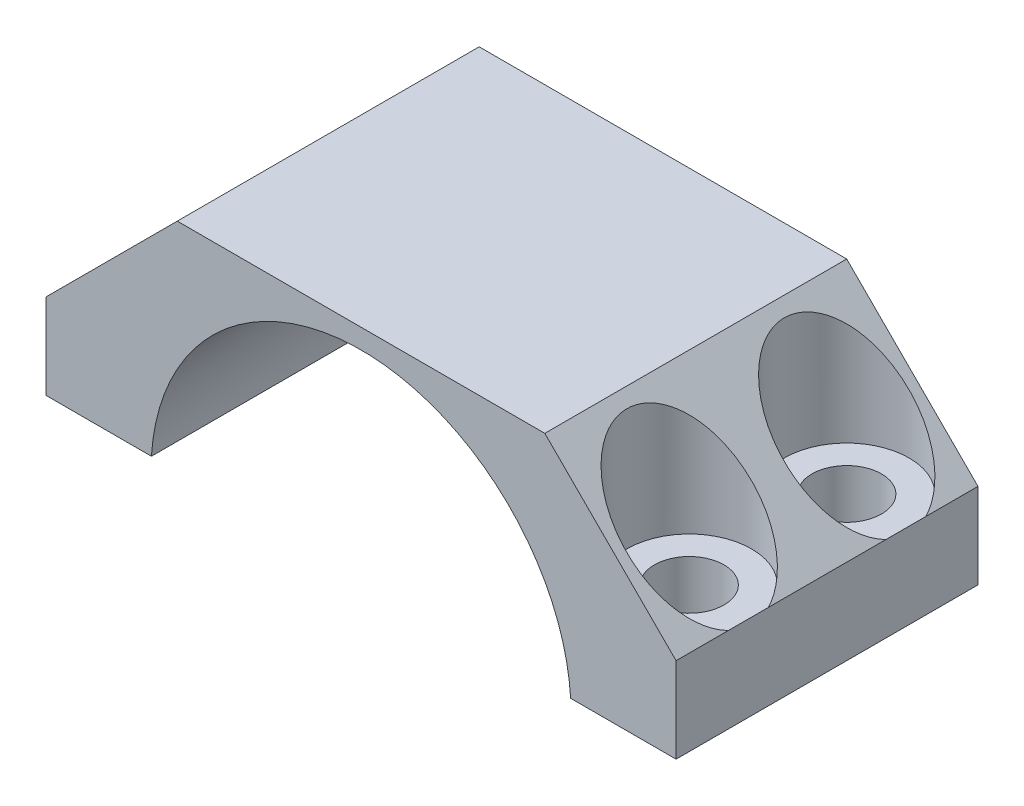
ISO-10303-21;
HEADER;
FILE_DESCRIPTION(('STEP AP214'),'2;1');
FILE_NAME('part.step','',(''),(''),'','','');
FILE_SCHEMA(('AUTOMOTIVE_DESIGN { 1 0 10303 214 1 1 1 1 }'));
ENDSEC;
DATA;
#1=APPLICATION_CONTEXT('core data for automotive mechanical design processes');
#2=APPLICATION_PROTOCOL_DEFINITION('international standard','automotive_design',2000,#1);
#3=PRODUCT_CONTEXT('',#1,'mechanical');
#4=PRODUCT('Part','Part','',(#3));
#5=PRODUCT_RELATED_PRODUCT_CATEGORY('part','',(#4));
#6=PRODUCT_DEFINITION_FORMATION('','',#4);
#7=PRODUCT_DEFINITION_CONTEXT('part definition',#1,'design');
#8=PRODUCT_DEFINITION('design','',#6,#7);
#9=PRODUCT_DEFINITION_SHAPE('','',#8);
#10=(LENGTH_UNIT() NAMED_UNIT(*) SI_UNIT(.MILLI.,.METRE.));
#11=(NAMED_UNIT(*) PLANE_ANGLE_UNIT() SI_UNIT($,.RADIAN.));
#12=(NAMED_UNIT(*) SI_UNIT($,.STERADIAN.) SOLID_ANGLE_UNIT());
#13=UNCERTAINTY_MEASURE_WITH_UNIT(LENGTH_MEASURE(1.E-05),#10,'distance_accuracy_value','');
#14=(GEOMETRIC_REPRESENTATION_CONTEXT(3) GLOBAL_UNCERTAINTY_ASSIGNED_CONTEXT((#13)) GLOBAL_UNIT_ASSIGNED_CONTEXT((#10,
#11,#12)) REPRESENTATION_CONTEXT('',''));
#15=CARTESIAN_POINT('',(0.,0.,0.));
#16=DIRECTION('',(0.,0.,1.));
#17=DIRECTION('',(1.,0.,0.));
#18=AXIS2_PLACEMENT_3D('',#15,#16,#17);
#19=CARTESIAN_POINT('',(-2.36061170209893E-13,0.,11.5));
#20=DIRECTION('',(0.,0.,-1.));
#21=DIRECTION('',(-0.999999999999999,0.,0.));
#22=AXIS2_PLACEMENT_3D('',#19,#20,#21);
#23=CYLINDRICAL_SURFACE('',#22,16.);
#24=CARTESIAN_POINT('',(-2.36061170209893E-13,0.,11.5));
#25=DIRECTION('',(0.,0.,1.));
#26=DIRECTION('',(0.999999999999999,0.,0.));
#27=AXIS2_PLACEMENT_3D('',#24,#25,#26);
#28=CIRCLE('',#27,16.);
#29=CARTESIAN_POINT('',(15.9687194226709,1.0000000000001,11.5000000000001));
#30=VERTEX_POINT('',#29);
#31=CARTESIAN_POINT('',(-15.9687194226715,1.,11.5));
#32=VERTEX_POINT('',#31);
#33=EDGE_CURVE('E141',#30,#32,#28,.T.);
#34=ORIENTED_EDGE('',*,*,#33,.T.);
#35=DIRECTION('',(0.,0.,-1.));
#36=VECTOR('',#35,1.);
#37=CARTESIAN_POINT('',(-15.9687194226715,1.,11.5));
#38=LINE('',#37,#36);
#39=CARTESIAN_POINT('',(-15.9687194226713,0.999999999999987,-11.4999999999999));
#40=VERTEX_POINT('',#39);
#41=EDGE_CURVE('E216',#32,#40,#38,.T.);
#42=ORIENTED_EDGE('',*,*,#41,.T.);
#43=CARTESIAN_POINT('',(-2.63539190871427E-13,0.,-11.4999999999999));
#44=DIRECTION('',(0.,0.,1.));
#45=DIRECTION('',(0.999999999999999,0.,0.));
#46=AXIS2_PLACEMENT_3D('',#43,#44,#45);
#47=CIRCLE('',#46,16.);
#48=CARTESIAN_POINT('',(15.9687194226708,1.,-11.4999999999997));
#49=VERTEX_POINT('',#48);
#50=EDGE_CURVE('E131',#49,#40,#47,.T.);
#51=ORIENTED_EDGE('',*,*,#50,.F.);
#52=DIRECTION('',(0.,0.,-1.));
#53=VECTOR('',#52,1.);
#54=CARTESIAN_POINT('',(15.9687194226709,1.0000000000001,11.5000000000001));
#55=LINE('',#54,#53);
#56=EDGE_CURVE('E32',#49,#30,#55,.F.);
#57=ORIENTED_EDGE('',*,*,#56,.T.);
#58=EDGE_LOOP('',(#34,#42,#51,#57));
#59=FACE_BOUND('',#58,.T.);
#60=ADVANCED_FACE('F17',(#59),#23,.F.);
#61=CARTESIAN_POINT('',(23.9999999999996,0.,11.5000000000001));
#62=DIRECTION('',(0.999999999999999,0.,0.));
#63=DIRECTION('',(0.,0.,-1.));
#64=AXIS2_PLACEMENT_3D('',#61,#62,#63);
#65=PLANE('',#64);
#66=DIRECTION('',(0.,-0.999999999999998,0.));
#67=VECTOR('',#66,1.);
#68=CARTESIAN_POINT('',(23.9999999999996,0.,11.5000000000001));
#69=LINE('',#68,#67);
#70=CARTESIAN_POINT('',(23.9999999999999,7.50000000000001,11.5000000000001));
#71=VERTEX_POINT('',#70);
#72=CARTESIAN_POINT('',(23.9999999999999,0.999999999999987,11.4999999999999));
#73=VERTEX_POINT('',#72);
#74=EDGE_CURVE('E123',#71,#73,#69,.T.);
#75=ORIENTED_EDGE('',*,*,#74,.T.);
#76=DIRECTION('',(0.,0.,1.));
#77=VECTOR('',#76,1.);
#78=CARTESIAN_POINT('',(23.9999999999999,0.999999999999987,11.4999999999999));
#79=LINE('',#78,#77);
#80=CARTESIAN_POINT('',(23.9999999999997,0.999999999999904,-11.4999999999999));
#81=VERTEX_POINT('',#80);
#82=EDGE_CURVE('E107',#81,#73,#79,.T.);
#83=ORIENTED_EDGE('',*,*,#82,.F.);
#84=DIRECTION('',(0.,-0.999999999999998,0.));
#85=VECTOR('',#84,1.);
#86=CARTESIAN_POINT('',(23.9999999999999,0.,-11.4999999999999));
#87=LINE('',#86,#85);
#88=CARTESIAN_POINT('',(23.9999999999996,7.49999999999962,-11.4999999999998));
#89=VERTEX_POINT('',#88);
#90=EDGE_CURVE('E120',#89,#81,#87,.T.);
#91=ORIENTED_EDGE('',*,*,#90,.F.);
#92=DIRECTION('',(0.,0.,1.));
#93=VECTOR('',#92,1.);
#94=CARTESIAN_POINT('',(23.9999999999997,7.4999999999999,-11.5009999999997));
#95=LINE('',#94,#93);
#96=CARTESIAN_POINT('',(23.9999999999995,7.49999999999997,-7.52069063257454));
#97=VERTEX_POINT('',#96);
#98=EDGE_CURVE('E241',#89,#97,#95,.T.);
#99=ORIENTED_EDGE('',*,*,#98,.T.);
#100=DIRECTION('',(0.,0.,-1.));
#101=VECTOR('',#100,1.);
#102=CARTESIAN_POINT('',(23.9999999999999,7.50000000000001,11.5000000000001));
#103=LINE('',#102,#101);
#104=CARTESIAN_POINT('',(23.9999999999998,7.49999999999991,-4.4793093674254));
#105=VERTEX_POINT('',#104);
#106=EDGE_CURVE('E142',#105,#97,#103,.T.);
#107=ORIENTED_EDGE('',*,*,#106,.F.);
#108=CARTESIAN_POINT('',(23.9999999999998,7.50000000000033,4.47930936742555));
#109=VERTEX_POINT('',#108);
#110=EDGE_CURVE('E240',#105,#109,#95,.T.);
#111=ORIENTED_EDGE('',*,*,#110,.T.);
#112=DIRECTION('',(0.,0.,-1.));
#113=VECTOR('',#112,1.);
#114=CARTESIAN_POINT('',(23.9999999999999,7.50000000000001,11.5000000000001));
#115=LINE('',#114,#113);
#116=CARTESIAN_POINT('',(23.9999999999998,7.50000000000019,7.52069063257463));
#117=VERTEX_POINT('',#116);
#118=EDGE_CURVE('E145',#117,#109,#115,.T.);
#119=ORIENTED_EDGE('',*,*,#118,.F.);
#120=EDGE_CURVE('E238',#117,#71,#95,.T.);
#121=ORIENTED_EDGE('',*,*,#120,.T.);
#122=EDGE_LOOP('',(#75,#83,#91,#99,#107,#111,#119,#121));
#123=FACE_BOUND('',#122,.T.);
#124=ADVANCED_FACE('F118',(#123),#65,.T.);
#125=CARTESIAN_POINT('',(-24.0000000000002,1.14491749414469E-13,11.5000000000001));
#126=DIRECTION('',(0.999999999999999,0.,0.));
#127=DIRECTION('',(0.,0.999999999999998,0.));
#128=AXIS2_PLACEMENT_3D('',#125,#126,#127);
#129=PLANE('',#128);
#130=DIRECTION('',(0.,0.,-1.));
#131=VECTOR('',#130,1.);
#132=CARTESIAN_POINT('',(-24.0000000000001,1.00000000000012,11.5000000000001));
#133=LINE('',#132,#131);
#134=CARTESIAN_POINT('',(-24.0000000000001,1.00000000000012,11.5000000000001));
#135=VERTEX_POINT('',#134);
#136=CARTESIAN_POINT('',(-24.0000000000004,1.00000000000001,-11.4999999999999));
#137=VERTEX_POINT('',#136);
#138=EDGE_CURVE('E40',#135,#137,#133,.T.);
#139=ORIENTED_EDGE('',*,*,#138,.F.);
#140=DIRECTION('',(0.,-0.999999999999998,0.));
#141=VECTOR('',#140,1.);
#142=CARTESIAN_POINT('',(-24.0000000000002,1.14491749414469E-13,11.5000000000001));
#143=LINE('',#142,#141);
#144=CARTESIAN_POINT('',(-24.0000000000001,7.4999999999999,11.4999999999998));
#145=VERTEX_POINT('',#144);
#146=EDGE_CURVE('E146',#145,#135,#143,.T.);
#147=ORIENTED_EDGE('',*,*,#146,.F.);
#148=DIRECTION('',(0.,0.,1.));
#149=VECTOR('',#148,1.);
#150=CARTESIAN_POINT('',(-24.0000000000003,7.49999999999988,-11.5010000000001));
#151=LINE('',#150,#149);
#152=CARTESIAN_POINT('',(-24.0000000000004,7.50000000000009,7.52069063257475));
#153=VERTEX_POINT('',#152);
#154=EDGE_CURVE('E200',#153,#145,#151,.T.);
#155=ORIENTED_EDGE('',*,*,#154,.F.);
#156=DIRECTION('',(0.,0.,-1.));
#157=VECTOR('',#156,1.);
#158=CARTESIAN_POINT('',(-24.0000000000001,7.49999999999993,11.4999999999998));
#159=LINE('',#158,#157);
#160=CARTESIAN_POINT('',(-24.0000000000001,7.50000000000009,4.47930936742536));
#161=VERTEX_POINT('',#160);
#162=EDGE_CURVE('E11',#153,#161,#159,.T.);
#163=ORIENTED_EDGE('',*,*,#162,.T.);
#164=CARTESIAN_POINT('',(-24.0000000000002,7.50000000000011,-4.47930936742534));
#165=VERTEX_POINT('',#164);
#166=EDGE_CURVE('E157',#165,#161,#151,.T.);
#167=ORIENTED_EDGE('',*,*,#166,.F.);
#168=DIRECTION('',(0.,0.,-1.));
#169=VECTOR('',#168,1.);
#170=CARTESIAN_POINT('',(-24.0000000000001,7.49999999999993,11.4999999999998));
#171=LINE('',#170,#169);
#172=CARTESIAN_POINT('',(-24.0000000000003,7.50000000000012,-7.52069063257466));
#173=VERTEX_POINT('',#172);
#174=EDGE_CURVE('E25',#165,#173,#171,.T.);
#175=ORIENTED_EDGE('',*,*,#174,.T.);
#176=CARTESIAN_POINT('',(-24.0000000000003,7.49999999999999,-11.5));
#177=VERTEX_POINT('',#176);
#178=EDGE_CURVE('E155',#177,#173,#151,.T.);
#179=ORIENTED_EDGE('',*,*,#178,.F.);
#180=DIRECTION('',(0.,-0.999999999999998,0.));
#181=VECTOR('',#180,1.);
#182=CARTESIAN_POINT('',(-24.0000000000001,0.,-11.5000000000001));
#183=LINE('',#182,#181);
#184=EDGE_CURVE('E133',#177,#137,#183,.T.);
#185=ORIENTED_EDGE('',*,*,#184,.T.);
#186=EDGE_LOOP('',(#139,#147,#155,#163,#167,#175,#179,#185));
#187=FACE_BOUND('',#186,.T.);
#188=ADVANCED_FACE('F154',(#187),#129,.F.);
#189=CARTESIAN_POINT('',(-2.36061170209893E-13,0.,11.5));
#190=DIRECTION('',(0.,0.,1.));
#191=DIRECTION('',(0.999999999999999,0.,0.));
#192=AXIS2_PLACEMENT_3D('',#189,#190,#191);
#193=PLANE('',#192);
#194=ORIENTED_EDGE('',*,*,#146,.T.);
#195=DIRECTION('',(-0.999999999999999,0.,0.));
#196=VECTOR('',#195,1.);
#197=CARTESIAN_POINT('',(-24.0000000000001,1.00000000000012,11.5000000000001));
#198=LINE('',#197,#196);
#199=EDGE_CURVE('E124',#32,#135,#198,.T.);
#200=ORIENTED_EDGE('',*,*,#199,.F.);
#201=ORIENTED_EDGE('',*,*,#33,.F.);
#202=EDGE_CURVE('E204',#73,#30,#198,.T.);
#203=ORIENTED_EDGE('',*,*,#202,.F.);
#204=ORIENTED_EDGE('',*,*,#74,.F.);
#205=DIRECTION('',(0.707106781186548,-0.707106781186545,0.));
#206=VECTOR('',#205,1.);
#207=CARTESIAN_POINT('',(13.9999999999998,17.5,11.5000000000001));
#208=LINE('',#207,#206);
#209=CARTESIAN_POINT('',(13.9999999999998,17.5,11.5000000000001));
#210=VERTEX_POINT('',#209);
#211=EDGE_CURVE('E235',#210,#71,#208,.T.);
#212=ORIENTED_EDGE('',*,*,#211,.F.);
#213=DIRECTION('',(0.999999999999999,0.,0.));
#214=VECTOR('',#213,1.);
#215=CARTESIAN_POINT('',(-1.78099985239559E-13,17.5,11.5));
#216=LINE('',#215,#214);
#217=CARTESIAN_POINT('',(-14.0000000000001,17.5000000000001,11.5));
#218=VERTEX_POINT('',#217);
#219=EDGE_CURVE('E189',#218,#210,#216,.T.);
#220=ORIENTED_EDGE('',*,*,#219,.F.);
#221=DIRECTION('',(0.707106781186547,0.707106781186546,0.));
#222=VECTOR('',#221,1.);
#223=CARTESIAN_POINT('',(-24.0000000000001,7.4999999999999,11.4999999999998));
#224=LINE('',#223,#222);
#225=EDGE_CURVE('E198',#145,#218,#224,.T.);
#226=ORIENTED_EDGE('',*,*,#225,.F.);
#227=EDGE_LOOP('',(#194,#200,#201,#203,#204,#212,#220,#226));
#228=FACE_BOUND('',#227,.T.);
#229=ADVANCED_FACE('F195',(#228),#193,.T.);
#230=CARTESIAN_POINT('',(-2.63539190871427E-13,0.,-11.4999999999999));
#231=DIRECTION('',(0.,0.,1.));
#232=DIRECTION('',(0.999999999999999,0.,0.));
#233=AXIS2_PLACEMENT_3D('',#230,#231,#232);
#234=PLANE('',#233);
#235=DIRECTION('',(0.999999999999999,0.,0.));
#236=VECTOR('',#235,1.);
#237=CARTESIAN_POINT('',(-24.0000000000003,1.00000000000001,-11.5));
#238=LINE('',#237,#236);
#239=EDGE_CURVE('E113',#137,#40,#238,.T.);
#240=ORIENTED_EDGE('',*,*,#239,.F.);
#241=ORIENTED_EDGE('',*,*,#184,.F.);
#242=DIRECTION('',(-0.707106781186547,-0.707106781186546,0.));
#243=VECTOR('',#242,1.);
#244=CARTESIAN_POINT('',(-24.0000000000003,7.49999999999999,-11.5));
#245=LINE('',#244,#243);
#246=CARTESIAN_POINT('',(-14.0000000000003,17.5,-11.4999999999999));
#247=VERTEX_POINT('',#246);
#248=EDGE_CURVE('E223',#247,#177,#245,.T.);
#249=ORIENTED_EDGE('',*,*,#248,.F.);
#250=DIRECTION('',(0.999999999999999,0.,0.));
#251=VECTOR('',#250,1.);
#252=CARTESIAN_POINT('',(-2.68028051036259E-13,17.5000000000001,-11.5));
#253=LINE('',#252,#251);
#254=CARTESIAN_POINT('',(13.9999999999995,17.4999999999999,-11.5));
#255=VERTEX_POINT('',#254);
#256=EDGE_CURVE('E130',#247,#255,#253,.T.);
#257=ORIENTED_EDGE('',*,*,#256,.T.);
#258=DIRECTION('',(-0.707106781186548,0.707106781186545,0.));
#259=VECTOR('',#258,1.);
#260=CARTESIAN_POINT('',(13.9999999999995,17.4999999999999,-11.5));
#261=LINE('',#260,#259);
#262=EDGE_CURVE('E129',#89,#255,#261,.T.);
#263=ORIENTED_EDGE('',*,*,#262,.F.);
#264=ORIENTED_EDGE('',*,*,#90,.T.);
#265=EDGE_CURVE('E103',#49,#81,#238,.T.);
#266=ORIENTED_EDGE('',*,*,#265,.F.);
#267=ORIENTED_EDGE('',*,*,#50,.T.);
#268=EDGE_LOOP('',(#240,#241,#249,#257,#263,#264,#266,#267));
#269=FACE_BOUND('',#268,.T.);
#270=ADVANCED_FACE('F127',(#269),#234,.F.);
#271=CARTESIAN_POINT('',(19.4999999999998,17.4999999999999,-5.99999999999978));
#272=DIRECTION('',(0.,0.999999999999998,0.));
#273=DIRECTION('',(0.,0.,1.));
#274=AXIS2_PLACEMENT_3D('',#271,#272,#273);
#275=CYLINDRICAL_SURFACE('',#274,2.65);
#276=CARTESIAN_POINT('',(19.4999999999998,7.5000000000001,-5.99999999999984));
#277=DIRECTION('',(0.,0.999999999999998,0.));
#278=DIRECTION('',(0.,0.,1.));
#279=AXIS2_PLACEMENT_3D('',#276,#277,#278);
#280=CIRCLE('',#279,2.65);
#281=CARTESIAN_POINT('',(19.4999999999998,7.5000000000001,-3.34999999999978));
#282=VERTEX_POINT('',#281);
#283=EDGE_CURVE('E135',#282,#282,#280,.T.);
#284=CARTESIAN_POINT('',(19.5,1.,-5.99999999999994));
#285=DIRECTION('',(0.,-0.999999999999998,0.));
#286=DIRECTION('',(0.999999999999999,0.,0.));
#287=AXIS2_PLACEMENT_3D('',#284,#285,#286);
#288=CIRCLE('',#287,2.65);
#289=CARTESIAN_POINT('',(19.4999999999998,1.,-3.34999999999977));
#290=VERTEX_POINT('',#289);
#291=EDGE_CURVE('E212',#290,#290,#288,.F.);
#292=CARTESIAN_POINT('',(19.4999999999998,7.5000000000001,-3.34999999999978));
#293=CARTESIAN_POINT('',(19.4999999999998,7.43229166666677,-3.34999999999978));
#294=CARTESIAN_POINT('',(19.4999999999998,7.36458333333343,-3.34999999999978));
#295=CARTESIAN_POINT('',(19.4999999999998,7.22916666666677,-3.34999999999978));
#296=CARTESIAN_POINT('',(19.4999999999998,7.16145833333343,-3.34999999999978));
#297=CARTESIAN_POINT('',(19.4999999999998,7.02604166666676,-3.34999999999978));
#298=CARTESIAN_POINT('',(19.4999999999998,6.95833333333343,-3.34999999999978));
#299=CARTESIAN_POINT('',(19.4999999999998,6.82291666666676,-3.34999999999978));
#300=CARTESIAN_POINT('',(19.4999999999998,6.75520833333343,-3.34999999999978));
#301=CARTESIAN_POINT('',(19.4999999999998,6.61979166666676,-3.34999999999978));
#302=CARTESIAN_POINT('',(19.4999999999998,6.55208333333342,-3.34999999999978));
#303=CARTESIAN_POINT('',(19.4999999999998,6.41666666666675,-3.34999999999978));
#304=CARTESIAN_POINT('',(19.4999999999998,6.34895833333342,-3.34999999999978));
#305=CARTESIAN_POINT('',(19.4999999999998,6.21354166666675,-3.34999999999978));
#306=CARTESIAN_POINT('',(19.4999999999998,6.14583333333342,-3.34999999999978));
#307=CARTESIAN_POINT('',(19.4999999999998,6.01041666666675,-3.34999999999978));
#308=CARTESIAN_POINT('',(19.4999999999998,5.94270833333341,-3.34999999999978));
#309=CARTESIAN_POINT('',(19.4999999999998,5.80729166666674,-3.34999999999978));
#310=CARTESIAN_POINT('',(19.4999999999998,5.73958333333341,-3.34999999999978));
#311=CARTESIAN_POINT('',(19.4999999999998,5.60416666666674,-3.34999999999978));
#312=CARTESIAN_POINT('',(19.4999999999998,5.53645833333341,-3.34999999999978));
#313=CARTESIAN_POINT('',(19.4999999999998,5.40104166666674,-3.34999999999978));
#314=CARTESIAN_POINT('',(19.4999999999998,5.3333333333334,-3.34999999999978));
#315=CARTESIAN_POINT('',(19.4999999999998,5.19791666666674,-3.34999999999978));
#316=CARTESIAN_POINT('',(19.4999999999998,5.1302083333334,-3.34999999999978));
#317=CARTESIAN_POINT('',(19.4999999999998,4.99479166666673,-3.34999999999978));
#318=CARTESIAN_POINT('',(19.4999999999998,4.9270833333334,-3.34999999999978));
#319=CARTESIAN_POINT('',(19.4999999999998,4.79166666666673,-3.34999999999978));
#320=CARTESIAN_POINT('',(19.4999999999998,4.72395833333339,-3.34999999999978));
#321=CARTESIAN_POINT('',(19.4999999999998,4.58854166666672,-3.34999999999978));
#322=CARTESIAN_POINT('',(19.4999999999998,4.52083333333339,-3.34999999999978));
#323=CARTESIAN_POINT('',(19.4999999999998,4.38541666666672,-3.34999999999978));
#324=CARTESIAN_POINT('',(19.4999999999998,4.31770833333339,-3.34999999999978));
#325=CARTESIAN_POINT('',(19.4999999999998,4.18229166666672,-3.34999999999978));
#326=CARTESIAN_POINT('',(19.4999999999998,4.11458333333338,-3.34999999999978));
#327=CARTESIAN_POINT('',(19.4999999999998,3.97916666666672,-3.34999999999978));
#328=CARTESIAN_POINT('',(19.4999999999998,3.91145833333338,-3.34999999999978));
#329=CARTESIAN_POINT('',(19.4999999999998,3.77604166666671,-3.34999999999978));
#330=CARTESIAN_POINT('',(19.4999999999998,3.70833333333338,-3.34999999999978));
#331=CARTESIAN_POINT('',(19.4999999999998,3.57291666666671,-3.34999999999978));
#332=CARTESIAN_POINT('',(19.4999999999998,3.50520833333337,-3.34999999999978));
#333=CARTESIAN_POINT('',(19.4999999999998,3.36979166666671,-3.34999999999978));
#334=CARTESIAN_POINT('',(19.4999999999998,3.30208333333337,-3.34999999999978));
#335=CARTESIAN_POINT('',(19.4999999999998,3.1666666666667,-3.34999999999978));
#336=CARTESIAN_POINT('',(19.4999999999998,3.09895833333337,-3.34999999999978));
#337=CARTESIAN_POINT('',(19.4999999999998,2.9635416666667,-3.34999999999978));
#338=CARTESIAN_POINT('',(19.4999999999998,2.89583333333337,-3.34999999999977));
#339=CARTESIAN_POINT('',(19.4999999999998,2.7604166666667,-3.34999999999977));
#340=CARTESIAN_POINT('',(19.4999999999998,2.69270833333336,-3.34999999999977));
#341=CARTESIAN_POINT('',(19.4999999999998,2.55729166666669,-3.34999999999977));
#342=CARTESIAN_POINT('',(19.4999999999998,2.48958333333336,-3.34999999999977));
#343=CARTESIAN_POINT('',(19.4999999999998,2.35416666666669,-3.34999999999977));
#344=CARTESIAN_POINT('',(19.4999999999998,2.28645833333336,-3.34999999999977));
#345=CARTESIAN_POINT('',(19.4999999999998,2.15104166666669,-3.34999999999977));
#346=CARTESIAN_POINT('',(19.4999999999998,2.08333333333335,-3.34999999999977));
#347=CARTESIAN_POINT('',(19.4999999999998,1.94791666666668,-3.34999999999977));
#348=CARTESIAN_POINT('',(19.4999999999998,1.88020833333335,-3.34999999999977));
#349=CARTESIAN_POINT('',(19.4999999999998,1.74479166666668,-3.34999999999977));
#350=CARTESIAN_POINT('',(19.4999999999998,1.67708333333335,-3.34999999999977));
#351=CARTESIAN_POINT('',(19.4999999999998,1.54166666666668,-3.34999999999977));
#352=CARTESIAN_POINT('',(19.4999999999998,1.47395833333334,-3.34999999999977));
#353=CARTESIAN_POINT('',(19.4999999999998,1.33854166666667,-3.34999999999977));
#354=CARTESIAN_POINT('',(19.4999999999998,1.27083333333334,-3.34999999999977));
#355=CARTESIAN_POINT('',(19.4999999999998,1.13541666666667,-3.34999999999977));
#356=CARTESIAN_POINT('',(19.4999999999998,1.06770833333334,-3.34999999999977));
#357=CARTESIAN_POINT('',(19.4999999999998,1.,-3.34999999999977));
#358=B_SPLINE_CURVE_WITH_KNOTS('',3,(#292,#293,#294,#295,#296,#297,#298,#299,#300,#301,#302,
#303,#304,#305,#306,#307,#308,#309,#310,#311,#312,#313,#314,#315,#316,#317,#318,#319,#320,#321,
#322,#323,#324,#325,#326,#327,#328,#329,#330,#331,#332,#333,#334,#335,#336,#337,#338,#339,#340,
#341,#342,#343,#344,#345,#346,#347,#348,#349,#350,#351,#352,#353,#354,#355,#356,#357),
.UNSPECIFIED.,.F.,.F.,(4,2,2,2,2,2,2,2,2,2,2,2,2,2,2,2,2,2,2,2,2,2,2,2,2,2,2,2,2,2,2,2,4),(0.,
0.203125000000004,0.406250000000006,0.609375000000009,0.812500000000013,1.01562500000002,
1.21875000000002,1.42187500000002,1.62500000000003,1.82812500000003,2.03125000000003,
2.23437500000003,2.43750000000004,2.64062500000004,2.84375000000004,3.04687500000005,
3.25000000000005,3.45312500000005,3.65625000000006,3.85937500000006,4.06250000000006,
4.26562500000007,4.46875000000007,4.67187500000007,4.87500000000008,5.07812500000008,
5.28125000000008,5.48437500000009,5.68750000000009,5.89062500000009,6.0937500000001,
6.2968750000001,6.5000000000001),.UNSPECIFIED.);
#359=EDGE_CURVE('BSEAM292',#282,#290,#358,.T.);
#360=ORIENTED_EDGE('',*,*,#283,.T.);
#361=ORIENTED_EDGE('',*,*,#291,.F.);
#362=ORIENTED_EDGE('',*,*,#359,.T.);
#363=ORIENTED_EDGE('',*,*,#359,.F.);
#364=EDGE_LOOP('',(#360,#362,#361,#363));
#365=FACE_BOUND('',#364,.T.);
#366=ADVANCED_FACE('F292',(#365),#275,.F.);
#367=CARTESIAN_POINT('',(19.4999999999998,17.4999999999999,6.0000000000003));
#368=DIRECTION('',(0.,0.999999999999998,0.));
#369=DIRECTION('',(0.,0.,1.));
#370=AXIS2_PLACEMENT_3D('',#367,#368,#369);
#371=CYLINDRICAL_SURFACE('',#370,2.65);
#372=CARTESIAN_POINT('',(19.4999999999998,7.49999999999991,6.00000000000025));
#373=DIRECTION('',(0.,0.999999999999998,0.));
#374=DIRECTION('',(0.,0.,1.));
#375=AXIS2_PLACEMENT_3D('',#372,#373,#374);
#376=CIRCLE('',#375,2.65);
#377=CARTESIAN_POINT('',(19.4999999999998,7.49999999999991,8.6500000000003));
#378=VERTEX_POINT('',#377);
#379=EDGE_CURVE('E178',#378,#378,#376,.T.);
#380=CARTESIAN_POINT('',(19.4999999999997,0.999999999999876,6.00000000000007));
#381=DIRECTION('',(0.,-0.999999999999998,0.));
#382=DIRECTION('',(0.999999999999999,0.,0.));
#383=AXIS2_PLACEMENT_3D('',#380,#381,#382);
#384=CIRCLE('',#383,2.65);
#385=CARTESIAN_POINT('',(19.4999999999998,0.999999999999876,8.65000000000031));
#386=VERTEX_POINT('',#385);
#387=EDGE_CURVE('E209',#386,#386,#384,.F.);
#388=CARTESIAN_POINT('',(19.4999999999998,7.49999999999991,8.6500000000003));
#389=CARTESIAN_POINT('',(19.4999999999998,7.43229166666658,8.6500000000003));
#390=CARTESIAN_POINT('',(19.4999999999998,7.36458333333324,8.6500000000003));
#391=CARTESIAN_POINT('',(19.4999999999998,7.22916666666657,8.6500000000003));
#392=CARTESIAN_POINT('',(19.4999999999998,7.16145833333324,8.6500000000003));
#393=CARTESIAN_POINT('',(19.4999999999998,7.02604166666658,8.6500000000003));
#394=CARTESIAN_POINT('',(19.4999999999998,6.95833333333324,8.6500000000003));
#395=CARTESIAN_POINT('',(19.4999999999998,6.82291666666657,8.6500000000003));
#396=CARTESIAN_POINT('',(19.4999999999998,6.75520833333324,8.6500000000003));
#397=CARTESIAN_POINT('',(19.4999999999998,6.61979166666657,8.6500000000003));
#398=CARTESIAN_POINT('',(19.4999999999998,6.55208333333324,8.6500000000003));
#399=CARTESIAN_POINT('',(19.4999999999998,6.41666666666657,8.6500000000003));
#400=CARTESIAN_POINT('',(19.4999999999998,6.34895833333324,8.6500000000003));
#401=CARTESIAN_POINT('',(19.4999999999998,6.21354166666657,8.6500000000003));
#402=CARTESIAN_POINT('',(19.4999999999998,6.14583333333324,8.6500000000003));
#403=CARTESIAN_POINT('',(19.4999999999998,6.01041666666657,8.6500000000003));
#404=CARTESIAN_POINT('',(19.4999999999998,5.94270833333323,8.6500000000003));
#405=CARTESIAN_POINT('',(19.4999999999998,5.80729166666657,8.6500000000003));
#406=CARTESIAN_POINT('',(19.4999999999998,5.73958333333323,8.6500000000003));
#407=CARTESIAN_POINT('',(19.4999999999998,5.60416666666657,8.6500000000003));
#408=CARTESIAN_POINT('',(19.4999999999998,5.53645833333323,8.6500000000003));
#409=CARTESIAN_POINT('',(19.4999999999998,5.40104166666657,8.6500000000003));
#410=CARTESIAN_POINT('',(19.4999999999998,5.33333333333323,8.6500000000003));
#411=CARTESIAN_POINT('',(19.4999999999998,5.19791666666657,8.6500000000003));
#412=CARTESIAN_POINT('',(19.4999999999998,5.13020833333323,8.6500000000003));
#413=CARTESIAN_POINT('',(19.4999999999998,4.99479166666656,8.6500000000003));
#414=CARTESIAN_POINT('',(19.4999999999998,4.92708333333323,8.6500000000003));
#415=CARTESIAN_POINT('',(19.4999999999998,4.79166666666656,8.6500000000003));
#416=CARTESIAN_POINT('',(19.4999999999998,4.72395833333323,8.6500000000003));
#417=CARTESIAN_POINT('',(19.4999999999998,4.58854166666656,8.6500000000003));
#418=CARTESIAN_POINT('',(19.4999999999998,4.52083333333323,8.6500000000003));
#419=CARTESIAN_POINT('',(19.4999999999998,4.38541666666656,8.6500000000003));
#420=CARTESIAN_POINT('',(19.4999999999998,4.31770833333323,8.6500000000003));
#421=CARTESIAN_POINT('',(19.4999999999998,4.18229166666656,8.6500000000003));
#422=CARTESIAN_POINT('',(19.4999999999998,4.11458333333323,8.6500000000003));
#423=CARTESIAN_POINT('',(19.4999999999998,3.97916666666656,8.6500000000003));
#424=CARTESIAN_POINT('',(19.4999999999998,3.91145833333323,8.6500000000003));
#425=CARTESIAN_POINT('',(19.4999999999998,3.77604166666656,8.6500000000003));
#426=CARTESIAN_POINT('',(19.4999999999998,3.70833333333322,8.6500000000003));
#427=CARTESIAN_POINT('',(19.4999999999998,3.57291666666656,8.6500000000003));
#428=CARTESIAN_POINT('',(19.4999999999998,3.50520833333322,8.65000000000031));
#429=CARTESIAN_POINT('',(19.4999999999998,3.36979166666656,8.65000000000031));
#430=CARTESIAN_POINT('',(19.4999999999998,3.30208333333322,8.65000000000031));
#431=CARTESIAN_POINT('',(19.4999999999998,3.16666666666656,8.65000000000031));
#432=CARTESIAN_POINT('',(19.4999999999998,3.09895833333322,8.65000000000031));
#433=CARTESIAN_POINT('',(19.4999999999998,2.96354166666655,8.65000000000031));
#434=CARTESIAN_POINT('',(19.4999999999998,2.89583333333322,8.65000000000031));
#435=CARTESIAN_POINT('',(19.4999999999998,2.76041666666655,8.65000000000031));
#436=CARTESIAN_POINT('',(19.4999999999998,2.69270833333322,8.65000000000031));
#437=CARTESIAN_POINT('',(19.4999999999998,2.55729166666655,8.65000000000031));
#438=CARTESIAN_POINT('',(19.4999999999998,2.48958333333322,8.65000000000031));
#439=CARTESIAN_POINT('',(19.4999999999998,2.35416666666655,8.65000000000031));
#440=CARTESIAN_POINT('',(19.4999999999998,2.28645833333322,8.65000000000031));
#441=CARTESIAN_POINT('',(19.4999999999998,2.15104166666655,8.65000000000031));
#442=CARTESIAN_POINT('',(19.4999999999998,2.08333333333322,8.65000000000031));
#443=CARTESIAN_POINT('',(19.4999999999998,1.94791666666655,8.65000000000031));
#444=CARTESIAN_POINT('',(19.4999999999998,1.88020833333322,8.65000000000031));
#445=CARTESIAN_POINT('',(19.4999999999998,1.74479166666655,8.65000000000031));
#446=CARTESIAN_POINT('',(19.4999999999998,1.67708333333321,8.65000000000031));
#447=CARTESIAN_POINT('',(19.4999999999998,1.54166666666655,8.65000000000031));
#448=CARTESIAN_POINT('',(19.4999999999998,1.47395833333321,8.65000000000031));
#449=CARTESIAN_POINT('',(19.4999999999998,1.33854166666655,8.65000000000031));
#450=CARTESIAN_POINT('',(19.4999999999998,1.27083333333321,8.65000000000031));
#451=CARTESIAN_POINT('',(19.4999999999998,1.13541666666654,8.65000000000031));
#452=CARTESIAN_POINT('',(19.4999999999998,1.06770833333321,8.65000000000031));
#453=CARTESIAN_POINT('',(19.4999999999998,0.999999999999876,8.65000000000031));
#454=B_SPLINE_CURVE_WITH_KNOTS('',3,(#388,#389,#390,#391,#392,#393,#394,#395,#396,#397,#398,
#399,#400,#401,#402,#403,#404,#405,#406,#407,#408,#409,#410,#411,#412,#413,#414,#415,#416,#417,
#418,#419,#420,#421,#422,#423,#424,#425,#426,#427,#428,#429,#430,#431,#432,#433,#434,#435,#436,
#437,#438,#439,#440,#441,#442,#443,#444,#445,#446,#447,#448,#449,#450,#451,#452,#453),
.UNSPECIFIED.,.F.,.F.,(4,2,2,2,2,2,2,2,2,2,2,2,2,2,2,2,2,2,2,2,2,2,2,2,2,2,2,2,2,2,2,2,4),(0.,
0.203125000000002,0.40625,0.609375000000002,0.812500000000004,1.015625,1.21875000000001,
1.42187500000001,1.62500000000001,1.82812500000001,2.03125000000001,2.23437500000001,
2.43750000000001,2.64062500000001,2.84375000000001,3.04687500000001,3.25000000000002,
3.45312500000002,3.65625000000002,3.85937500000002,4.06250000000002,4.26562500000002,
4.46875000000002,4.67187500000002,4.87500000000002,5.07812500000003,5.28125000000003,
5.48437500000003,5.68750000000003,5.89062500000003,6.09375000000003,6.29687500000003,
6.50000000000003),.UNSPECIFIED.);
#455=EDGE_CURVE('BSEAM297',#378,#386,#454,.T.);
#456=ORIENTED_EDGE('',*,*,#379,.T.);
#457=ORIENTED_EDGE('',*,*,#387,.F.);
#458=ORIENTED_EDGE('',*,*,#455,.T.);
#459=ORIENTED_EDGE('',*,*,#455,.F.);
#460=EDGE_LOOP('',(#456,#458,#457,#459));
#461=FACE_BOUND('',#460,.T.);
#462=ADVANCED_FACE('F297',(#461),#371,.F.);
#463=CARTESIAN_POINT('',(-19.5000000000003,17.4999999999999,-6.00000000000011));
#464=DIRECTION('',(0.,0.999999999999998,0.));
#465=DIRECTION('',(0.,0.,1.));
#466=AXIS2_PLACEMENT_3D('',#463,#464,#465);
#467=CYLINDRICAL_SURFACE('',#466,2.65);
#468=CARTESIAN_POINT('',(-19.5000000000003,7.50000000000002,-6.00000000000011));
#469=DIRECTION('',(0.,0.999999999999998,0.));
#470=DIRECTION('',(0.,0.,1.));
#471=AXIS2_PLACEMENT_3D('',#468,#469,#470);
#472=CIRCLE('',#471,2.65);
#473=CARTESIAN_POINT('',(-19.5000000000002,7.50000000000002,-3.35000000000011));
#474=VERTEX_POINT('',#473);
#475=EDGE_CURVE('E165',#474,#474,#472,.T.);
#476=CARTESIAN_POINT('',(-19.5000000000003,1.0000000000001,-6.00000000000024));
#477=DIRECTION('',(0.,-0.999999999999998,0.));
#478=DIRECTION('',(0.999999999999999,0.,0.));
#479=AXIS2_PLACEMENT_3D('',#476,#477,#478);
#480=CIRCLE('',#479,2.65);
#481=CARTESIAN_POINT('',(-19.5000000000002,1.0000000000001,-3.35000000000011));
#482=VERTEX_POINT('',#481);
#483=EDGE_CURVE('E206',#482,#482,#480,.F.);
#484=CARTESIAN_POINT('',(-19.5000000000002,7.50000000000002,-3.35000000000011));
#485=CARTESIAN_POINT('',(-19.5000000000002,7.43229166666669,-3.35000000000011));
#486=CARTESIAN_POINT('',(-19.5000000000002,7.36458333333336,-3.35000000000011));
#487=CARTESIAN_POINT('',(-19.5000000000002,7.22916666666669,-3.35000000000011));
#488=CARTESIAN_POINT('',(-19.5000000000002,7.16145833333336,-3.35000000000011));
#489=CARTESIAN_POINT('',(-19.5000000000002,7.02604166666669,-3.35000000000011));
#490=CARTESIAN_POINT('',(-19.5000000000002,6.95833333333336,-3.35000000000011));
#491=CARTESIAN_POINT('',(-19.5000000000002,6.8229166666667,-3.35000000000011));
#492=CARTESIAN_POINT('',(-19.5000000000002,6.75520833333336,-3.35000000000011));
#493=CARTESIAN_POINT('',(-19.5000000000002,6.6197916666667,-3.35000000000011));
#494=CARTESIAN_POINT('',(-19.5000000000002,6.55208333333337,-3.35000000000011));
#495=CARTESIAN_POINT('',(-19.5000000000002,6.4166666666667,-3.35000000000011));
#496=CARTESIAN_POINT('',(-19.5000000000002,6.34895833333337,-3.35000000000011));
#497=CARTESIAN_POINT('',(-19.5000000000002,6.2135416666667,-3.35000000000011));
#498=CARTESIAN_POINT('',(-19.5000000000002,6.14583333333337,-3.35000000000011));
#499=CARTESIAN_POINT('',(-19.5000000000002,6.01041666666671,-3.35000000000011));
#500=CARTESIAN_POINT('',(-19.5000000000002,5.94270833333337,-3.35000000000011));
#501=CARTESIAN_POINT('',(-19.5000000000002,5.80729166666671,-3.35000000000011));
#502=CARTESIAN_POINT('',(-19.5000000000002,5.73958333333337,-3.35000000000011));
#503=CARTESIAN_POINT('',(-19.5000000000002,5.60416666666671,-3.35000000000011));
#504=CARTESIAN_POINT('',(-19.5000000000002,5.53645833333338,-3.35000000000011));
#505=CARTESIAN_POINT('',(-19.5000000000002,5.40104166666671,-3.35000000000011));
#506=CARTESIAN_POINT('',(-19.5000000000002,5.33333333333338,-3.35000000000011));
#507=CARTESIAN_POINT('',(-19.5000000000002,5.19791666666672,-3.35000000000011));
#508=CARTESIAN_POINT('',(-19.5000000000002,5.13020833333338,-3.35000000000011));
#509=CARTESIAN_POINT('',(-19.5000000000002,4.99479166666672,-3.35000000000011));
#510=CARTESIAN_POINT('',(-19.5000000000002,4.92708333333339,-3.35000000000011));
#511=CARTESIAN_POINT('',(-19.5000000000002,4.79166666666672,-3.35000000000011));
#512=CARTESIAN_POINT('',(-19.5000000000002,4.72395833333339,-3.35000000000011));
#513=CARTESIAN_POINT('',(-19.5000000000002,4.58854166666672,-3.35000000000011));
#514=CARTESIAN_POINT('',(-19.5000000000002,4.52083333333339,-3.35000000000011));
#515=CARTESIAN_POINT('',(-19.5000000000002,4.38541666666673,-3.35000000000011));
#516=CARTESIAN_POINT('',(-19.5000000000002,4.31770833333339,-3.35000000000011));
#517=CARTESIAN_POINT('',(-19.5000000000002,4.18229166666673,-3.35000000000011));
#518=CARTESIAN_POINT('',(-19.5000000000002,4.1145833333334,-3.35000000000011));
#519=CARTESIAN_POINT('',(-19.5000000000002,3.97916666666673,-3.35000000000011));
#520=CARTESIAN_POINT('',(-19.5000000000002,3.9114583333334,-3.35000000000011));
#521=CARTESIAN_POINT('',(-19.5000000000002,3.77604166666673,-3.35000000000011));
#522=CARTESIAN_POINT('',(-19.5000000000002,3.7083333333334,-3.35000000000011));
#523=CARTESIAN_POINT('',(-19.5000000000002,3.57291666666673,-3.35000000000011));
#524=CARTESIAN_POINT('',(-19.5000000000002,3.5052083333334,-3.35000000000011));
#525=CARTESIAN_POINT('',(-19.5000000000002,3.36979166666674,-3.35000000000011));
#526=CARTESIAN_POINT('',(-19.5000000000002,3.3020833333334,-3.35000000000011));
#527=CARTESIAN_POINT('',(-19.5000000000002,3.16666666666674,-3.35000000000011));
#528=CARTESIAN_POINT('',(-19.5000000000002,3.09895833333341,-3.35000000000011));
#529=CARTESIAN_POINT('',(-19.5000000000002,2.96354166666674,-3.35000000000011));
#530=CARTESIAN_POINT('',(-19.5000000000002,2.89583333333341,-3.35000000000011));
#531=CARTESIAN_POINT('',(-19.5000000000002,2.76041666666674,-3.35000000000011));
#532=CARTESIAN_POINT('',(-19.5000000000002,2.69270833333341,-3.35000000000011));
#533=CARTESIAN_POINT('',(-19.5000000000002,2.55729166666675,-3.35000000000011));
#534=CARTESIAN_POINT('',(-19.5000000000002,2.48958333333341,-3.35000000000011));
#535=CARTESIAN_POINT('',(-19.5000000000002,2.35416666666675,-3.35000000000011));
#536=CARTESIAN_POINT('',(-19.5000000000002,2.28645833333342,-3.35000000000011));
#537=CARTESIAN_POINT('',(-19.5000000000002,2.15104166666675,-3.35000000000011));
#538=CARTESIAN_POINT('',(-19.5000000000002,2.08333333333342,-3.35000000000011));
#539=CARTESIAN_POINT('',(-19.5000000000002,1.94791666666676,-3.35000000000011));
#540=CARTESIAN_POINT('',(-19.5000000000002,1.88020833333342,-3.35000000000011));
#541=CARTESIAN_POINT('',(-19.5000000000002,1.74479166666676,-3.35000000000011));
#542=CARTESIAN_POINT('',(-19.5000000000002,1.67708333333343,-3.35000000000011));
#543=CARTESIAN_POINT('',(-19.5000000000002,1.54166666666676,-3.35000000000011));
#544=CARTESIAN_POINT('',(-19.5000000000002,1.47395833333343,-3.35000000000011));
#545=CARTESIAN_POINT('',(-19.5000000000002,1.33854166666676,-3.35000000000011));
#546=CARTESIAN_POINT('',(-19.5000000000002,1.27083333333343,-3.35000000000011));
#547=CARTESIAN_POINT('',(-19.5000000000002,1.13541666666676,-3.35000000000011));
#548=CARTESIAN_POINT('',(-19.5000000000002,1.06770833333343,-3.35000000000011));
#549=CARTESIAN_POINT('',(-19.5000000000002,1.0000000000001,-3.35000000000011));
#550=B_SPLINE_CURVE_WITH_KNOTS('',3,(#484,#485,#486,#487,#488,#489,#490,#491,#492,#493,#494,
#495,#496,#497,#498,#499,#500,#501,#502,#503,#504,#505,#506,#507,#508,#509,#510,#511,#512,#513,
#514,#515,#516,#517,#518,#519,#520,#521,#522,#523,#524,#525,#526,#527,#528,#529,#530,#531,#532,
#533,#534,#535,#536,#537,#538,#539,#540,#541,#542,#543,#544,#545,#546,#547,#548,#549),
.UNSPECIFIED.,.F.,.F.,(4,2,2,2,2,2,2,2,2,2,2,2,2,2,2,2,2,2,2,2,2,2,2,2,2,2,2,2,2,2,2,2,4),(0.,
0.203124999999998,0.406249999999993,0.609374999999992,0.81249999999999,1.01562499999999,
1.21874999999999,1.42187499999998,1.62499999999998,1.82812499999998,2.03124999999998,
2.23437499999997,2.43749999999997,2.64062499999997,2.84374999999997,3.04687499999996,
3.24999999999996,3.45312499999996,3.65624999999995,3.85937499999995,4.06249999999995,
4.26562499999995,4.46874999999994,4.67187499999994,4.87499999999994,5.07812499999994,
5.28124999999994,5.48437499999993,5.68749999999993,5.89062499999993,6.09374999999993,
6.29687499999992,6.49999999999992),.UNSPECIFIED.);
#551=EDGE_CURVE('BSEAM308',#474,#482,#550,.T.);
#552=ORIENTED_EDGE('',*,*,#475,.T.);
#553=ORIENTED_EDGE('',*,*,#483,.F.);
#554=ORIENTED_EDGE('',*,*,#551,.T.);
#555=ORIENTED_EDGE('',*,*,#551,.F.);
#556=EDGE_LOOP('',(#552,#554,#553,#555));
#557=FACE_BOUND('',#556,.T.);
#558=ADVANCED_FACE('F308',(#557),#467,.F.);
#559=CARTESIAN_POINT('',(-19.5000000000003,17.5,5.9999999999999));
#560=DIRECTION('',(0.,0.999999999999998,0.));
#561=DIRECTION('',(0.,0.,1.));
#562=AXIS2_PLACEMENT_3D('',#559,#560,#561);
#563=CYLINDRICAL_SURFACE('',#562,2.65);
#564=CARTESIAN_POINT('',(-19.5000000000003,7.49999999999999,5.99999999999989));
#565=DIRECTION('',(0.,0.999999999999998,0.));
#566=DIRECTION('',(0.,0.,1.));
#567=AXIS2_PLACEMENT_3D('',#564,#565,#566);
#568=CIRCLE('',#567,2.65);
#569=CARTESIAN_POINT('',(-19.5000000000003,7.49999999999999,8.64999999999991));
#570=VERTEX_POINT('',#569);
#571=EDGE_CURVE('E166',#570,#570,#568,.T.);
#572=CARTESIAN_POINT('',(-19.5000000000004,1.00000000000001,6.00000000000004));
#573=DIRECTION('',(0.,-0.999999999999998,0.));
#574=DIRECTION('',(0.999999999999999,0.,0.));
#575=AXIS2_PLACEMENT_3D('',#572,#573,#574);
#576=CIRCLE('',#575,2.65);
#577=CARTESIAN_POINT('',(-19.5000000000003,1.00000000000001,8.64999999999991));
#578=VERTEX_POINT('',#577);
#579=EDGE_CURVE('E20',#578,#578,#576,.F.);
#580=CARTESIAN_POINT('',(-19.5000000000003,7.49999999999999,8.64999999999991));
#581=CARTESIAN_POINT('',(-19.5000000000003,7.43229166666666,8.64999999999991));
#582=CARTESIAN_POINT('',(-19.5000000000003,7.36458333333333,8.64999999999991));
#583=CARTESIAN_POINT('',(-19.5000000000003,7.22916666666666,8.64999999999991));
#584=CARTESIAN_POINT('',(-19.5000000000003,7.16145833333333,8.64999999999991));
#585=CARTESIAN_POINT('',(-19.5000000000003,7.02604166666666,8.64999999999991));
#586=CARTESIAN_POINT('',(-19.5000000000003,6.95833333333333,8.64999999999991));
#587=CARTESIAN_POINT('',(-19.5000000000003,6.82291666666666,8.64999999999991));
#588=CARTESIAN_POINT('',(-19.5000000000003,6.75520833333333,8.64999999999991));
#589=CARTESIAN_POINT('',(-19.5000000000003,6.61979166666666,8.64999999999991));
#590=CARTESIAN_POINT('',(-19.5000000000003,6.55208333333333,8.64999999999991));
#591=CARTESIAN_POINT('',(-19.5000000000003,6.41666666666666,8.64999999999991));
#592=CARTESIAN_POINT('',(-19.5000000000003,6.34895833333333,8.64999999999991));
#593=CARTESIAN_POINT('',(-19.5000000000003,6.21354166666666,8.64999999999991));
#594=CARTESIAN_POINT('',(-19.5000000000003,6.14583333333333,8.64999999999991));
#595=CARTESIAN_POINT('',(-19.5000000000003,6.01041666666667,8.64999999999991));
#596=CARTESIAN_POINT('',(-19.5000000000003,5.94270833333333,8.64999999999991));
#597=CARTESIAN_POINT('',(-19.5000000000003,5.80729166666667,8.64999999999991));
#598=CARTESIAN_POINT('',(-19.5000000000003,5.73958333333333,8.64999999999991));
#599=CARTESIAN_POINT('',(-19.5000000000003,5.60416666666667,8.64999999999991));
#600=CARTESIAN_POINT('',(-19.5000000000003,5.53645833333333,8.64999999999991));
#601=CARTESIAN_POINT('',(-19.5000000000003,5.40104166666667,8.64999999999991));
#602=CARTESIAN_POINT('',(-19.5000000000003,5.33333333333333,8.64999999999991));
#603=CARTESIAN_POINT('',(-19.5000000000003,5.19791666666667,8.64999999999991));
#604=CARTESIAN_POINT('',(-19.5000000000003,5.13020833333334,8.64999999999991));
#605=CARTESIAN_POINT('',(-19.5000000000003,4.99479166666667,8.64999999999991));
#606=CARTESIAN_POINT('',(-19.5000000000003,4.92708333333334,8.64999999999991));
#607=CARTESIAN_POINT('',(-19.5000000000003,4.79166666666667,8.64999999999991));
#608=CARTESIAN_POINT('',(-19.5000000000003,4.72395833333334,8.64999999999991));
#609=CARTESIAN_POINT('',(-19.5000000000003,4.58854166666667,8.64999999999991));
#610=CARTESIAN_POINT('',(-19.5000000000003,4.52083333333334,8.64999999999991));
#611=CARTESIAN_POINT('',(-19.5000000000003,4.38541666666667,8.64999999999991));
#612=CARTESIAN_POINT('',(-19.5000000000003,4.31770833333334,8.64999999999991));
#613=CARTESIAN_POINT('',(-19.5000000000003,4.18229166666667,8.64999999999991));
#614=CARTESIAN_POINT('',(-19.5000000000003,4.11458333333334,8.64999999999991));
#615=CARTESIAN_POINT('',(-19.5000000000003,3.97916666666667,8.64999999999991));
#616=CARTESIAN_POINT('',(-19.5000000000003,3.91145833333334,8.64999999999991));
#617=CARTESIAN_POINT('',(-19.5000000000003,3.77604166666667,8.64999999999991));
#618=CARTESIAN_POINT('',(-19.5000000000003,3.70833333333334,8.64999999999991));
#619=CARTESIAN_POINT('',(-19.5000000000003,3.57291666666667,8.64999999999991));
#620=CARTESIAN_POINT('',(-19.5000000000003,3.50520833333334,8.64999999999991));
#621=CARTESIAN_POINT('',(-19.5000000000003,3.36979166666667,8.64999999999991));
#622=CARTESIAN_POINT('',(-19.5000000000003,3.30208333333334,8.64999999999991));
#623=CARTESIAN_POINT('',(-19.5000000000003,3.16666666666668,8.64999999999991));
#624=CARTESIAN_POINT('',(-19.5000000000003,3.09895833333334,8.64999999999991));
#625=CARTESIAN_POINT('',(-19.5000000000003,2.96354166666668,8.64999999999991));
#626=CARTESIAN_POINT('',(-19.5000000000003,2.89583333333334,8.64999999999991));
#627=CARTESIAN_POINT('',(-19.5000000000003,2.76041666666668,8.64999999999991));
#628=CARTESIAN_POINT('',(-19.5000000000003,2.69270833333334,8.64999999999991));
#629=CARTESIAN_POINT('',(-19.5000000000003,2.55729166666668,8.64999999999991));
#630=CARTESIAN_POINT('',(-19.5000000000003,2.48958333333334,8.64999999999991));
#631=CARTESIAN_POINT('',(-19.5000000000003,2.35416666666668,8.64999999999991));
#632=CARTESIAN_POINT('',(-19.5000000000003,2.28645833333335,8.64999999999991));
#633=CARTESIAN_POINT('',(-19.5000000000003,2.15104166666668,8.64999999999991));
#634=CARTESIAN_POINT('',(-19.5000000000003,2.08333333333335,8.64999999999991));
#635=CARTESIAN_POINT('',(-19.5000000000003,1.94791666666668,8.64999999999991));
#636=CARTESIAN_POINT('',(-19.5000000000003,1.88020833333335,8.64999999999991));
#637=CARTESIAN_POINT('',(-19.5000000000003,1.74479166666668,8.64999999999991));
#638=CARTESIAN_POINT('',(-19.5000000000003,1.67708333333335,8.64999999999991));
#639=CARTESIAN_POINT('',(-19.5000000000003,1.54166666666668,8.64999999999991));
#640=CARTESIAN_POINT('',(-19.5000000000003,1.47395833333335,8.64999999999991));
#641=CARTESIAN_POINT('',(-19.5000000000003,1.33854166666668,8.64999999999991));
#642=CARTESIAN_POINT('',(-19.5000000000003,1.27083333333335,8.64999999999991));
#643=CARTESIAN_POINT('',(-19.5000000000003,1.13541666666668,8.64999999999991));
#644=CARTESIAN_POINT('',(-19.5000000000003,1.06770833333335,8.64999999999991));
#645=CARTESIAN_POINT('',(-19.5000000000003,1.00000000000001,8.64999999999991));
#646=B_SPLINE_CURVE_WITH_KNOTS('',3,(#580,#581,#582,#583,#584,#585,#586,#587,#588,#589,#590,
#591,#592,#593,#594,#595,#596,#597,#598,#599,#600,#601,#602,#603,#604,#605,#606,#607,#608,#609,
#610,#611,#612,#613,#614,#615,#616,#617,#618,#619,#620,#621,#622,#623,#624,#625,#626,#627,#628,
#629,#630,#631,#632,#633,#634,#635,#636,#637,#638,#639,#640,#641,#642,#643,#644,#645),
.UNSPECIFIED.,.F.,.F.,(4,2,2,2,2,2,2,2,2,2,2,2,2,2,2,2,2,2,2,2,2,2,2,2,2,2,2,2,2,2,2,2,4),(0.,
0.203125,0.406249999999997,0.609374999999997,0.812499999999997,1.015625,1.21875,
1.42187499999999,1.62499999999999,1.82812499999999,2.03124999999999,2.23437499999999,
2.43749999999999,2.64062499999999,2.84374999999999,3.04687499999999,3.24999999999999,
3.45312499999999,3.65624999999999,3.85937499999999,4.06249999999999,4.26562499999998,
4.46874999999998,4.67187499999998,4.87499999999998,5.07812499999998,5.28124999999998,
5.48437499999998,5.68749999999998,5.89062499999998,6.09374999999998,6.29687499999998,
6.49999999999998),.UNSPECIFIED.);
#647=EDGE_CURVE('BSEAM287',#570,#578,#646,.T.);
#648=ORIENTED_EDGE('',*,*,#571,.T.);
#649=ORIENTED_EDGE('',*,*,#579,.F.);
#650=ORIENTED_EDGE('',*,*,#647,.T.);
#651=ORIENTED_EDGE('',*,*,#647,.F.);
#652=EDGE_LOOP('',(#648,#650,#649,#651));
#653=FACE_BOUND('',#652,.T.);
#654=ADVANCED_FACE('F287',(#653),#563,.F.);
#655=CARTESIAN_POINT('',(-1.78099985239559E-13,17.5,11.5));
#656=DIRECTION('',(0.,0.999999999999998,0.));
#657=DIRECTION('',(-0.999999999999999,0.,0.));
#658=AXIS2_PLACEMENT_3D('',#655,#656,#657);
#659=PLANE('',#658);
#660=DIRECTION('',(0.,0.,1.));
#661=VECTOR('',#660,1.);
#662=CARTESIAN_POINT('',(-14.0000000000003,17.5,-11.501));
#663=LINE('',#662,#661);
#664=EDGE_CURVE('E226',#247,#218,#663,.T.);
#665=ORIENTED_EDGE('',*,*,#664,.T.);
#666=ORIENTED_EDGE('',*,*,#219,.T.);
#667=DIRECTION('',(0.,0.,1.));
#668=VECTOR('',#667,1.);
#669=CARTESIAN_POINT('',(13.9999999999997,17.5,-11.5010000000001));
#670=LINE('',#669,#668);
#671=EDGE_CURVE('E237',#255,#210,#670,.T.);
#672=ORIENTED_EDGE('',*,*,#671,.F.);
#673=ORIENTED_EDGE('',*,*,#256,.F.);
#674=EDGE_LOOP('',(#665,#666,#672,#673));
#675=FACE_BOUND('',#674,.T.);
#676=ADVANCED_FACE('F284',(#675),#659,.T.);
#677=CARTESIAN_POINT('',(22.1499999999998,7.50000000000002,-5.99999999999988));
#678=DIRECTION('',(0.,-0.999999999999998,0.));
#679=DIRECTION('',(0.,0.,-1.));
#680=AXIS2_PLACEMENT_3D('',#677,#678,#679);
#681=PLANE('',#680);
#682=ORIENTED_EDGE('',*,*,#106,.T.);
#683=CARTESIAN_POINT('',(19.4999999999998,7.5000000000001,-5.99999999999984));
#684=DIRECTION('',(0.,0.999999999999998,0.));
#685=DIRECTION('',(0.,0.,1.));
#686=AXIS2_PLACEMENT_3D('',#683,#684,#685);
#687=CIRCLE('',#686,4.75);
#688=EDGE_CURVE('E181',#97,#105,#687,.T.);
#689=ORIENTED_EDGE('',*,*,#688,.T.);
#690=EDGE_LOOP('',(#682,#689));
#691=FACE_BOUND('',#690,.T.);
#692=ORIENTED_EDGE('',*,*,#283,.F.);
#693=EDGE_LOOP('',(#692));
#694=FACE_BOUND('',#693,.T.);
#695=ADVANCED_FACE('F286',(#691,#694),#681,.F.);
#696=CARTESIAN_POINT('',(19.4999999999998,17.4999999999999,-5.99999999999978));
#697=DIRECTION('',(0.,0.999999999999998,0.));
#698=DIRECTION('',(0.,0.,1.));
#699=AXIS2_PLACEMENT_3D('',#696,#697,#698);
#700=CYLINDRICAL_SURFACE('',#699,4.75);
#701=ORIENTED_EDGE('',*,*,#688,.F.);
#702=CARTESIAN_POINT('',(19.4999999999998,11.9999999999998,-5.99999999999984));
#703=DIRECTION('',(-0.707106781186546,-0.707106781186547,0.));
#704=DIRECTION('',(-0.707106781186548,0.707106781186545,0.));
#705=AXIS2_PLACEMENT_3D('',#702,#703,#704);
#706=ELLIPSE('',#705,6.71751442127219,4.75);
#707=EDGE_CURVE('E232',#105,#97,#706,.T.);
#708=ORIENTED_EDGE('',*,*,#707,.F.);
#709=EDGE_LOOP('',(#701,#708));
#710=FACE_BOUND('',#709,.T.);
#711=ADVANCED_FACE('F301',(#710),#700,.F.);
#712=CARTESIAN_POINT('',(22.1499999999996,7.49999999999991,6.00000000000013));
#713=DIRECTION('',(0.,-0.999999999999998,0.));
#714=DIRECTION('',(0.,0.,-1.));
#715=AXIS2_PLACEMENT_3D('',#712,#713,#714);
#716=PLANE('',#715);
#717=ORIENTED_EDGE('',*,*,#118,.T.);
#718=CARTESIAN_POINT('',(19.4999999999998,7.49999999999991,6.00000000000025));
#719=DIRECTION('',(0.,0.999999999999998,0.));
#720=DIRECTION('',(0.,0.,1.));
#721=AXIS2_PLACEMENT_3D('',#718,#719,#720);
#722=CIRCLE('',#721,4.75);
#723=EDGE_CURVE('E169',#109,#117,#722,.T.);
#724=ORIENTED_EDGE('',*,*,#723,.T.);
#725=EDGE_LOOP('',(#717,#724));
#726=FACE_BOUND('',#725,.T.);
#727=ORIENTED_EDGE('',*,*,#379,.F.);
#728=EDGE_LOOP('',(#727));
#729=FACE_BOUND('',#728,.T.);
#730=ADVANCED_FACE('F253',(#726,#729),#716,.F.);
#731=CARTESIAN_POINT('',(19.4999999999998,17.4999999999999,6.0000000000003));
#732=DIRECTION('',(0.,0.999999999999998,0.));
#733=DIRECTION('',(0.,0.,1.));
#734=AXIS2_PLACEMENT_3D('',#731,#732,#733);
#735=CYLINDRICAL_SURFACE('',#734,4.75);
#736=ORIENTED_EDGE('',*,*,#723,.F.);
#737=CARTESIAN_POINT('',(19.4999999999995,12.0000000000001,6.00000000000013));
#738=DIRECTION('',(-0.707106781186546,-0.707106781186547,0.));
#739=DIRECTION('',(-0.707106781186548,0.707106781186545,0.));
#740=AXIS2_PLACEMENT_3D('',#737,#738,#739);
#741=ELLIPSE('',#740,6.71751442127219,4.75);
#742=EDGE_CURVE('E230',#117,#109,#741,.T.);
#743=ORIENTED_EDGE('',*,*,#742,.F.);
#744=EDGE_LOOP('',(#736,#743));
#745=FACE_BOUND('',#744,.T.);
#746=ADVANCED_FACE('F257',(#745),#735,.F.);
#747=CARTESIAN_POINT('',(-16.8500000000004,7.50000000000005,-5.99999999999991));
#748=DIRECTION('',(0.,-0.999999999999998,0.));
#749=DIRECTION('',(0.,0.,-1.));
#750=AXIS2_PLACEMENT_3D('',#747,#748,#749);
#751=PLANE('',#750);
#752=ORIENTED_EDGE('',*,*,#475,.F.);
#753=EDGE_LOOP('',(#752));
#754=FACE_BOUND('',#753,.T.);
#755=CARTESIAN_POINT('',(-19.5000000000003,7.50000000000002,-6.00000000000011));
#756=DIRECTION('',(0.,0.999999999999998,0.));
#757=DIRECTION('',(0.,0.,1.));
#758=AXIS2_PLACEMENT_3D('',#755,#756,#757);
#759=CIRCLE('',#758,4.75);
#760=EDGE_CURVE('E162',#165,#173,#759,.T.);
#761=ORIENTED_EDGE('',*,*,#760,.T.);
#762=ORIENTED_EDGE('',*,*,#174,.F.);
#763=EDGE_LOOP('',(#761,#762));
#764=FACE_BOUND('',#763,.T.);
#765=ADVANCED_FACE('F161',(#754,#764),#751,.F.);
#766=CARTESIAN_POINT('',(-19.5000000000003,17.4999999999999,-6.00000000000011));
#767=DIRECTION('',(0.,0.999999999999998,0.));
#768=DIRECTION('',(0.,0.,1.));
#769=AXIS2_PLACEMENT_3D('',#766,#767,#768);
#770=CYLINDRICAL_SURFACE('',#769,4.75);
#771=ORIENTED_EDGE('',*,*,#760,.F.);
#772=CARTESIAN_POINT('',(-19.5000000000003,12.,-6.00000000000012));
#773=DIRECTION('',(0.707106781186547,-0.707106781186545,0.));
#774=DIRECTION('',(0.707106781186547,0.707106781186546,0.));
#775=AXIS2_PLACEMENT_3D('',#772,#773,#774);
#776=ELLIPSE('',#775,6.7175144212722,4.75);
#777=EDGE_CURVE('E221',#173,#165,#776,.T.);
#778=ORIENTED_EDGE('',*,*,#777,.F.);
#779=EDGE_LOOP('',(#771,#778));
#780=FACE_BOUND('',#779,.T.);
#781=ADVANCED_FACE('F319',(#780),#770,.F.);
#782=CARTESIAN_POINT('',(-16.8500000000001,7.50000000000001,6.00000000000015));
#783=DIRECTION('',(0.,-0.999999999999998,0.));
#784=DIRECTION('',(0.,0.,-1.));
#785=AXIS2_PLACEMENT_3D('',#782,#783,#784);
#786=PLANE('',#785);
#787=ORIENTED_EDGE('',*,*,#571,.F.);
#788=EDGE_LOOP('',(#787));
#789=FACE_BOUND('',#788,.T.);
#790=CARTESIAN_POINT('',(-19.5000000000003,7.49999999999999,5.99999999999989));
#791=DIRECTION('',(0.,0.999999999999998,0.));
#792=DIRECTION('',(0.,0.,1.));
#793=AXIS2_PLACEMENT_3D('',#790,#791,#792);
#794=CIRCLE('',#793,4.75);
#795=EDGE_CURVE('E172',#153,#161,#794,.T.);
#796=ORIENTED_EDGE('',*,*,#795,.T.);
#797=ORIENTED_EDGE('',*,*,#162,.F.);
#798=EDGE_LOOP('',(#796,#797));
#799=FACE_BOUND('',#798,.T.);
#800=ADVANCED_FACE('F323',(#789,#799),#786,.F.);
#801=CARTESIAN_POINT('',(-19.5000000000003,17.5,5.9999999999999));
#802=DIRECTION('',(0.,0.999999999999998,0.));
#803=DIRECTION('',(0.,0.,1.));
#804=AXIS2_PLACEMENT_3D('',#801,#802,#803);
#805=CYLINDRICAL_SURFACE('',#804,4.75);
#806=ORIENTED_EDGE('',*,*,#795,.F.);
#807=CARTESIAN_POINT('',(-19.5000000000002,11.9999999999998,5.9999999999999));
#808=DIRECTION('',(0.707106781186547,-0.707106781186545,0.));
#809=DIRECTION('',(0.707106781186547,0.707106781186546,0.));
#810=AXIS2_PLACEMENT_3D('',#807,#808,#809);
#811=ELLIPSE('',#810,6.7175144212722,4.75);
#812=EDGE_CURVE('E219',#161,#153,#811,.T.);
#813=ORIENTED_EDGE('',*,*,#812,.F.);
#814=EDGE_LOOP('',(#806,#813));
#815=FACE_BOUND('',#814,.T.);
#816=ADVANCED_FACE('F329',(#815),#805,.F.);
#817=CARTESIAN_POINT('',(13.9999999999997,17.5,-11.5010000000001));
#818=DIRECTION('',(-0.707106781186546,-0.707106781186547,0.));
#819=DIRECTION('',(0.707106781186548,-0.707106781186545,0.));
#820=AXIS2_PLACEMENT_3D('',#817,#818,#819);
#821=PLANE('',#820);
#822=ORIENTED_EDGE('',*,*,#262,.T.);
#823=ORIENTED_EDGE('',*,*,#671,.T.);
#824=ORIENTED_EDGE('',*,*,#211,.T.);
#825=ORIENTED_EDGE('',*,*,#120,.F.);
#826=ORIENTED_EDGE('',*,*,#742,.T.);
#827=ORIENTED_EDGE('',*,*,#110,.F.);
#828=ORIENTED_EDGE('',*,*,#707,.T.);
#829=ORIENTED_EDGE('',*,*,#98,.F.);
#830=EDGE_LOOP('',(#822,#823,#824,#825,#826,#827,#828,#829));
#831=FACE_BOUND('',#830,.T.);
#832=ADVANCED_FACE('F258',(#831),#821,.F.);
#833=CARTESIAN_POINT('',(-24.0000000000003,7.49999999999988,-11.5010000000001));
#834=DIRECTION('',(0.707106781186547,-0.707106781186545,0.));
#835=DIRECTION('',(0.707106781186547,0.707106781186546,0.));
#836=AXIS2_PLACEMENT_3D('',#833,#834,#835);
#837=PLANE('',#836);
#838=ORIENTED_EDGE('',*,*,#248,.T.);
#839=ORIENTED_EDGE('',*,*,#178,.T.);
#840=ORIENTED_EDGE('',*,*,#777,.T.);
#841=ORIENTED_EDGE('',*,*,#166,.T.);
#842=ORIENTED_EDGE('',*,*,#812,.T.);
#843=ORIENTED_EDGE('',*,*,#154,.T.);
#844=ORIENTED_EDGE('',*,*,#225,.T.);
#845=ORIENTED_EDGE('',*,*,#664,.F.);
#846=EDGE_LOOP('',(#838,#839,#840,#841,#842,#843,#844,#845));
#847=FACE_BOUND('',#846,.T.);
#848=ADVANCED_FACE('F264',(#847),#837,.F.);
#849=CARTESIAN_POINT('',(-2.29240005124072E-13,1.,1.17961196366423E-13));
#850=DIRECTION('',(0.,-0.999999999999998,0.));
#851=DIRECTION('',(0.999999999999999,0.,0.));
#852=AXIS2_PLACEMENT_3D('',#849,#850,#851);
#853=PLANE('',#852);
#854=ORIENTED_EDGE('',*,*,#483,.T.);
#855=EDGE_LOOP('',(#854));
#856=FACE_BOUND('',#855,.T.);
#857=ORIENTED_EDGE('',*,*,#579,.T.);
#858=EDGE_LOOP('',(#857));
#859=FACE_BOUND('',#858,.T.);
#860=ORIENTED_EDGE('',*,*,#199,.T.);
#861=ORIENTED_EDGE('',*,*,#138,.T.);
#862=ORIENTED_EDGE('',*,*,#239,.T.);
#863=ORIENTED_EDGE('',*,*,#41,.F.);
#864=EDGE_LOOP('',(#860,#861,#862,#863));
#865=FACE_BOUND('',#864,.T.);
#866=ADVANCED_FACE('F262',(#856,#859,#865),#853,.T.);
#867=ORIENTED_EDGE('',*,*,#265,.T.);
#868=ORIENTED_EDGE('',*,*,#82,.T.);
#869=ORIENTED_EDGE('',*,*,#202,.T.);
#870=ORIENTED_EDGE('',*,*,#56,.F.);
#871=EDGE_LOOP('',(#867,#868,#869,#870));
#872=FACE_BOUND('',#871,.T.);
#873=ORIENTED_EDGE('',*,*,#387,.T.);
#874=EDGE_LOOP('',(#873));
#875=FACE_BOUND('',#874,.T.);
#876=ORIENTED_EDGE('',*,*,#291,.T.);
#877=EDGE_LOOP('',(#876));
#878=FACE_BOUND('',#877,.T.);
#879=ADVANCED_FACE('F105',(#872,#875,#878),#853,.T.);
#880=CLOSED_SHELL('',(#60,#124,#188,#229,#270,#366,#462,#558,#654,#676,#695,#711,#730,#746,#765,
#781,#800,#816,#832,#848,#866,#879));
#881=MANIFOLD_SOLID_BREP('B1',#880);
#882=ADVANCED_BREP_SHAPE_REPRESENTATION('',(#18,#881),#14);
#883=SHAPE_DEFINITION_REPRESENTATION(#9,#882);
ENDSEC;
END-ISO-10303-21;
